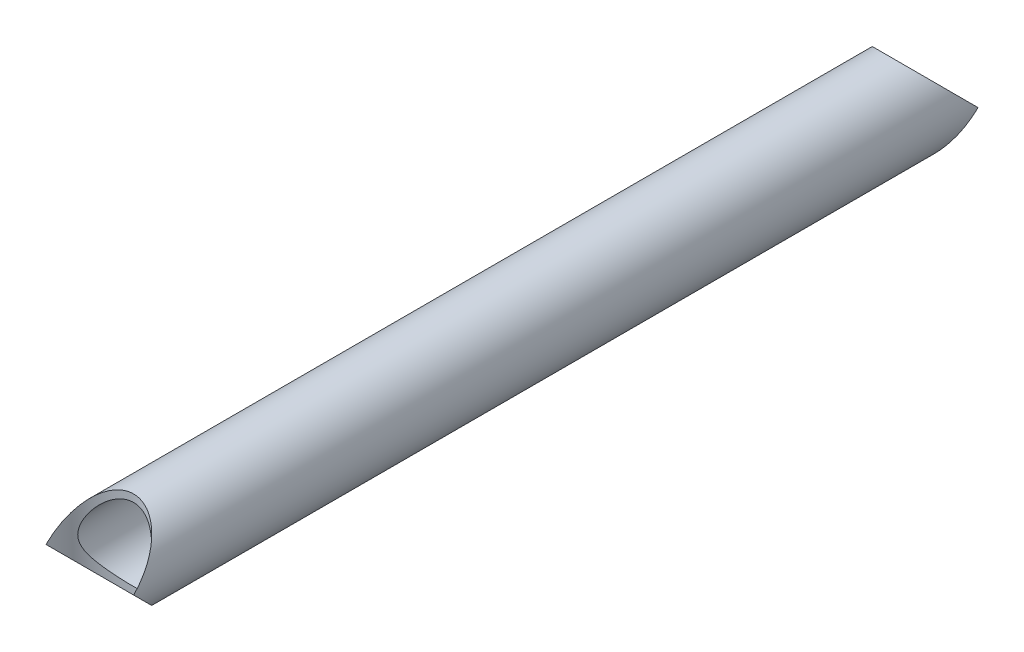
ISO-10303-21;
HEADER;
FILE_DESCRIPTION(('STEP AP214'),'2;1');
FILE_NAME('part.step','',(''),(''),'','','');
FILE_SCHEMA(('AUTOMOTIVE_DESIGN { 1 0 10303 214 1 1 1 1 }'));
ENDSEC;
DATA;
#1=APPLICATION_CONTEXT('core data for automotive mechanical design processes');
#2=APPLICATION_PROTOCOL_DEFINITION('international standard','automotive_design',2000,#1);
#3=PRODUCT_CONTEXT('',#1,'mechanical');
#4=PRODUCT('Part','Part','',(#3));
#5=PRODUCT_RELATED_PRODUCT_CATEGORY('part','',(#4));
#6=PRODUCT_DEFINITION_FORMATION('','',#4);
#7=PRODUCT_DEFINITION_CONTEXT('part definition',#1,'design');
#8=PRODUCT_DEFINITION('design','',#6,#7);
#9=PRODUCT_DEFINITION_SHAPE('','',#8);
#10=(LENGTH_UNIT() NAMED_UNIT(*) SI_UNIT(.MILLI.,.METRE.));
#11=(NAMED_UNIT(*) PLANE_ANGLE_UNIT() SI_UNIT($,.RADIAN.));
#12=(NAMED_UNIT(*) SI_UNIT($,.STERADIAN.) SOLID_ANGLE_UNIT());
#13=UNCERTAINTY_MEASURE_WITH_UNIT(LENGTH_MEASURE(1.E-05),#10,'distance_accuracy_value','');
#14=(GEOMETRIC_REPRESENTATION_CONTEXT(3) GLOBAL_UNCERTAINTY_ASSIGNED_CONTEXT((#13)) GLOBAL_UNIT_ASSIGNED_CONTEXT((#10,
#11,#12)) REPRESENTATION_CONTEXT('',''));
#15=CARTESIAN_POINT('',(0.,0.,0.));
#16=DIRECTION('',(0.,0.,1.));
#17=DIRECTION('',(1.,0.,0.));
#18=AXIS2_PLACEMENT_3D('',#15,#16,#17);
#19=CARTESIAN_POINT('',(0.,-609.6,0.));
#20=DIRECTION('',(0.,1.,0.));
#21=DIRECTION('',(1.,0.,0.));
#22=AXIS2_PLACEMENT_3D('',#19,#20,#21);
#23=CYLINDRICAL_SURFACE('',#22,21.082);
#24=CARTESIAN_POINT('',(0.,0.,0.));
#25=DIRECTION('',(0.,-0.707106781186548,0.707106781186548));
#26=DIRECTION('',(0.,0.707106781186548,0.707106781186548));
#27=AXIS2_PLACEMENT_3D('',#24,#25,#26);
#28=ELLIPSE('',#27,29.8144503219496,21.082);
#29=CARTESIAN_POINT('',(21.082,0.,0.));
#30=VERTEX_POINT('',#29);
#31=CARTESIAN_POINT('',(-21.082,0.,0.));
#32=VERTEX_POINT('',#31);
#33=EDGE_CURVE('E36',#30,#32,#28,.T.);
#34=ORIENTED_EDGE('',*,*,#33,.F.);
#35=CARTESIAN_POINT('',(0.,0.,0.));
#36=DIRECTION('',(0.,0.707106781186548,0.707106781186548));
#37=DIRECTION('',(0.,-0.707106781186548,0.707106781186548));
#38=AXIS2_PLACEMENT_3D('',#35,#36,#37);
#39=ELLIPSE('',#38,29.8144503219496,21.082);
#40=EDGE_CURVE('E49',#32,#30,#39,.T.);
#41=ORIENTED_EDGE('',*,*,#40,.F.);
#42=EDGE_LOOP('',(#34,#41));
#43=FACE_BOUND('',#42,.T.);
#44=CARTESIAN_POINT('',(-17.526,0.,11.7170835961855));
#45=CARTESIAN_POINT('',(-17.5260016378947,-0.311185239624754,11.7170794235319));
#46=CARTESIAN_POINT('',(-17.5176931015294,-0.622351445218559,11.7295369553151));
#47=CARTESIAN_POINT('',(-17.4846988539183,-1.24185385401228,11.7786627526484));
#48=CARTESIAN_POINT('',(-17.4600137345834,-1.55019015908704,11.8153301431635));
#49=CARTESIAN_POINT('',(-17.3948143787621,-2.16244529665251,11.9111077063955));
#50=CARTESIAN_POINT('',(-17.3542585500645,-2.4663503275123,11.970276837618));
#51=CARTESIAN_POINT('',(-17.2582022882152,-3.06720718463188,12.1083537448172));
#52=CARTESIAN_POINT('',(-17.2026991564801,-3.36415774479985,12.187265084866));
#53=CARTESIAN_POINT('',(-17.0535843130683,-4.06302745628092,12.3954854161195));
#54=CARTESIAN_POINT('',(-16.9535301925097,-4.46127907530088,12.5324954128564));
#55=CARTESIAN_POINT('',(-16.7288372054571,-5.24134070736922,12.8308841424232));
#56=CARTESIAN_POINT('',(-16.6041869119637,-5.62314297747684,12.992274193646));
#57=CARTESIAN_POINT('',(-16.3317636320621,-6.37126683424937,13.3331138948044));
#58=CARTESIAN_POINT('',(-16.1839327090337,-6.73754662963666,13.5126083819292));
#59=CARTESIAN_POINT('',(-15.8666576854035,-7.4540832758881,13.8837883044527));
#60=CARTESIAN_POINT('',(-15.6972143279038,-7.80434067708934,14.0754733205898));
#61=CARTESIAN_POINT('',(-15.2583916209031,-8.64017899381098,14.552604898062));
#62=CARTESIAN_POINT('',(-14.9778300302294,-9.11754391622342,14.8422186294483));
#63=CARTESIAN_POINT('',(-14.3747358658228,-10.0415160632169,15.427068966364));
#64=CARTESIAN_POINT('',(-14.0521855719281,-10.4881101794549,15.7223079006928));
#65=CARTESIAN_POINT('',(-13.3658527392673,-11.3497898907658,16.3097708832751));
#66=CARTESIAN_POINT('',(-13.0021052837983,-11.7649018003026,16.6019972690064));
#67=CARTESIAN_POINT('',(-12.233300311435,-12.5623875794975,17.1763567539256));
#68=CARTESIAN_POINT('',(-11.8282584025824,-12.944773718712,17.4584936125817));
#69=CARTESIAN_POINT('',(-11.0669192234582,-13.5970346278618,17.9480753218691));
#70=CARTESIAN_POINT('',(-10.7183987975034,-13.8736134382401,18.1587085988652));
#71=CARTESIAN_POINT('',(-9.99596445975381,-14.4028407038532,18.5661882812012));
#72=CARTESIAN_POINT('',(-9.62205154611136,-14.6554900987946,18.7630352278501));
#73=CARTESIAN_POINT('',(-8.85000453279148,-15.1342035654356,19.1392871353364));
#74=CARTESIAN_POINT('',(-8.45190333226408,-15.3603025729126,19.3187149616181));
#75=CARTESIAN_POINT('',(-7.63224400398983,-15.7836038697298,19.6569582270187));
#76=CARTESIAN_POINT('',(-7.21069012767881,-15.9808113730436,19.8157773847372));
#77=CARTESIAN_POINT('',(-6.42051007803403,-16.3122154450185,20.0840901579273));
#78=CARTESIAN_POINT('',(-6.05526187412119,-16.4514151662288,20.1973686661908));
#79=CARTESIAN_POINT('',(-5.31159989558677,-16.706346482185,20.4055542524311));
#80=CARTESIAN_POINT('',(-4.93318862342575,-16.822082509407,20.5004648001058));
#81=CARTESIAN_POINT('',(-4.16529168273311,-17.0284767212216,20.6701624989867));
#82=CARTESIAN_POINT('',(-3.77580987215481,-17.1191435267946,20.7449565677474));
#83=CARTESIAN_POINT('',(-2.98810662755952,-17.2740554751118,20.8729762207129));
#84=CARTESIAN_POINT('',(-2.58988509279097,-17.3383003130948,20.9262015561354));
#85=CARTESIAN_POINT('',(-1.78589985576378,-17.4394973865413,21.0101240435934));
#86=CARTESIAN_POINT('',(-1.38011148961267,-17.4763337840664,21.0407255758502));
#87=CARTESIAN_POINT('',(-0.565854491199032,-17.5216078754302,21.0783450739343));
#88=CARTESIAN_POINT('',(-0.15738585335124,-17.5300455100714,21.0853629906013));
#89=CARTESIAN_POINT('',(0.658840305394848,-17.5183673988472,21.0756550169734));
#90=CARTESIAN_POINT('',(1.06659785274316,-17.4982527387285,21.0589300295404));
#91=CARTESIAN_POINT('',(1.87807893983286,-17.4298388579758,21.0021181574441));
#92=CARTESIAN_POINT('',(2.28180261501628,-17.3815405868964,20.9620320598569));
#93=CARTESIAN_POINT('',(3.05546264031582,-17.2617419142674,20.8628075465109));
#94=CARTESIAN_POINT('',(3.42586003012291,-17.1919987114047,20.8051139320896));
#95=CARTESIAN_POINT('',(4.15817336909838,-17.0297069941817,20.6712086315105));
#96=CARTESIAN_POINT('',(4.52008977395022,-16.937159708176,20.5949979427882));
#97=CARTESIAN_POINT('',(5.23359484929569,-16.7304558932916,20.4253449651873));
#98=CARTESIAN_POINT('',(5.58518194067369,-16.6162960800062,20.3319000573192));
#99=CARTESIAN_POINT('',(6.27643426134676,-16.3677116370536,20.1292536222194));
#100=CARTESIAN_POINT('',(6.61609878682275,-16.2332858135049,20.0200511667184));
#101=CARTESIAN_POINT('',(7.31109089686547,-15.9331108592373,19.7774011684013));
#102=CARTESIAN_POINT('',(7.66523513049859,-15.765658679436,19.6426739100496));
#103=CARTESIAN_POINT('',(8.35689209437835,-15.4101996598829,19.3585354967505));
#104=CARTESIAN_POINT('',(8.69440404672022,-15.2221918600498,19.2091236559707));
#105=CARTESIAN_POINT('',(9.35209844960762,-14.8272083285566,18.8976558413728));
#106=CARTESIAN_POINT('',(9.67227794419842,-14.6202293775806,18.7355977222363));
#107=CARTESIAN_POINT('',(10.2948186721717,-14.1887580520627,18.4008796109905));
#108=CARTESIAN_POINT('',(10.5971773894446,-13.9642632148072,18.2282181287897));
#109=CARTESIAN_POINT('',(11.244684971049,-13.4507289160127,17.8375687941069));
#110=CARTESIAN_POINT('',(11.5856940585288,-13.1579624545575,17.6176099712067));
#111=CARTESIAN_POINT('',(12.2411720036753,-12.5504633562745,17.1686423372183));
#112=CARTESIAN_POINT('',(12.5556369249827,-12.2357274740969,16.9396321912342));
#113=CARTESIAN_POINT('',(13.1584286905593,-11.5850519846574,16.4757793097621));
#114=CARTESIAN_POINT('',(13.446714754031,-11.2490806325737,16.2409281763895));
#115=CARTESIAN_POINT('',(13.9965511777057,-10.5571079156422,15.7695396585636));
#116=CARTESIAN_POINT('',(14.2581033442004,-10.2011079065658,15.5330023891917));
#117=CARTESIAN_POINT('',(14.7570366580727,-9.46521810557,15.0598817475067));
#118=CARTESIAN_POINT('',(14.9941216137858,-9.08510932065605,14.8233262589546));
#119=CARTESIAN_POINT('',(15.4403622641035,-8.30410846278527,14.3579192105154));
#120=CARTESIAN_POINT('',(15.6495111177599,-7.90321133245439,14.1290695478423));
#121=CARTESIAN_POINT('',(16.0384509266286,-7.0806388364223,13.6859616011569));
#122=CARTESIAN_POINT('',(16.2182912005026,-6.65899996365618,13.4716791661005));
#123=CARTESIAN_POINT('',(16.5471956443401,-5.7935329548292,13.0655732903307));
#124=CARTESIAN_POINT('',(16.696280162227,-5.34971973228998,12.8737350372167));
#125=CARTESIAN_POINT('',(16.9096872269796,-4.6159917421715,12.5909260766296));
#126=CARTESIAN_POINT('',(16.9844727479109,-4.33305990670588,12.4896691875633));
#127=CARTESIAN_POINT('',(17.1206528131974,-3.75910386380244,12.3023316690525));
#128=CARTESIAN_POINT('',(17.1820521342226,-3.46808258489748,12.2162456282212));
#129=CARTESIAN_POINT('',(17.2904590721008,-2.87925352198581,12.0623224316295));
#130=CARTESIAN_POINT('',(17.3374971591084,-2.58146156719816,11.9944466768579));
#131=CARTESIAN_POINT('',(17.4164527674171,-1.97986154206129,11.8795111123051));
#132=CARTESIAN_POINT('',(17.4483707185722,-1.67605364299665,11.8324507107618));
#133=CARTESIAN_POINT('',(17.4965707933311,-1.06142244679824,11.7610644895283));
#134=CARTESIAN_POINT('',(17.5126944221406,-0.750559438662855,11.7369691864769));
#135=CARTESIAN_POINT('',(17.5283064038534,-0.127486752535119,11.7136418313979));
#136=CARTESIAN_POINT('',(17.5277956602287,0.184722851397884,11.7144084290319));
#137=CARTESIAN_POINT('',(17.5101485211154,0.807835261309463,11.7407693262134));
#138=CARTESIAN_POINT('',(17.4929998394571,1.11873693105035,11.7663819731513));
#139=CARTESIAN_POINT('',(17.4425276727906,1.73636752581663,11.8410705264514));
#140=CARTESIAN_POINT('',(17.4092017106118,2.04309580438799,11.8901500261935));
#141=CARTESIAN_POINT('',(17.3202684324222,2.70129580173779,12.0194075579903));
#142=CARTESIAN_POINT('',(17.2618591297115,3.05163094171089,12.1034240158727));
#143=CARTESIAN_POINT('',(17.125544653635,3.74168673817612,12.2955381960971));
#144=CARTESIAN_POINT('',(17.0476346833835,4.08140475984631,12.403641842824));
#145=CARTESIAN_POINT('',(16.8735380534471,4.75017183758825,12.6394597248944));
#146=CARTESIAN_POINT('',(16.7773015999041,5.07918889906018,12.7672272019709));
#147=CARTESIAN_POINT('',(16.5679251651736,5.72537291471267,13.0377868068708));
#148=CARTESIAN_POINT('',(16.4547840559982,6.04253907635777,13.1805799371149));
#149=CARTESIAN_POINT('',(16.1420461654977,6.84649854955788,13.5637984152024));
#150=CARTESIAN_POINT('',(15.9304484628453,7.32461540499263,13.8126893643339));
#151=CARTESIAN_POINT('',(15.469742749578,8.25327584896658,14.3268004694395));
#152=CARTESIAN_POINT('',(15.2206141148923,8.70380408430256,14.5920295559139));
#153=CARTESIAN_POINT('',(14.685783858587,9.57870297739549,15.1301886751321));
#154=CARTESIAN_POINT('',(14.4000361208074,10.0030396349768,15.4031280740317));
#155=CARTESIAN_POINT('',(13.7927902751821,10.8250002111713,15.9491834168155));
#156=CARTESIAN_POINT('',(13.4712992021977,11.2226293616244,16.2222993154787));
#157=CARTESIAN_POINT('',(12.7799006234576,12.0048882555959,16.7728164869347));
#158=CARTESIAN_POINT('',(12.4086316211086,12.3884749126374,17.0499957368036));
#159=CARTESIAN_POINT('',(11.6276478455591,13.1242664808955,17.5918888173235));
#160=CARTESIAN_POINT('',(11.2179265250184,13.4764660277999,17.8566005135371));
#161=CARTESIAN_POINT('',(10.3612672323301,14.145646554196,18.3668904148318));
#162=CARTESIAN_POINT('',(9.91442105137389,14.4627101247529,18.6125130662574));
#163=CARTESIAN_POINT('',(9.21669876910991,14.9093724844697,18.9623554646115));
#164=CARTESIAN_POINT('',(8.97958368951618,15.0534199394608,19.0758566609264));
#165=CARTESIAN_POINT('',(8.49628270026581,15.3313920219185,19.2959688093741));
#166=CARTESIAN_POINT('',(8.25009466435528,15.4653142538034,19.4025781300609));
#167=CARTESIAN_POINT('',(7.64828647045942,15.7740353493854,19.64938964824));
#168=CARTESIAN_POINT('',(7.28844211338097,15.9436374285179,19.7858779719994));
#169=CARTESIAN_POINT('',(6.55290444190079,16.2597758929261,20.0414998170308));
#170=CARTESIAN_POINT('',(6.17721525857188,16.4063182437829,20.1606378262551));
#171=CARTESIAN_POINT('',(5.41170805813672,16.6744852599453,20.3794627217077));
#172=CARTESIAN_POINT('',(5.02189676543482,16.7961216056681,20.4791587247984));
#173=CARTESIAN_POINT('',(4.23014401773319,17.012789133161,20.6572319450956));
#174=CARTESIAN_POINT('',(3.82820225407401,17.1078196373128,20.7356086193235));
#175=CARTESIAN_POINT('',(3.01240280049657,17.2702087031939,20.8697879593399));
#176=CARTESIAN_POINT('',(2.59848725210842,17.3373944048851,20.9254495787255));
#177=CARTESIAN_POINT('',(1.7643465795866,17.4420303309739,21.0122253324729));
#178=CARTESIAN_POINT('',(1.34412146523769,17.4794806014797,21.0433395048985));
#179=CARTESIAN_POINT('',(0.501049558004271,17.5239199181906,21.0802671778015));
#180=CARTESIAN_POINT('',(0.0782034121153955,17.5309162037693,21.0860866912022));
#181=CARTESIAN_POINT('',(-0.766452841317305,17.5143262226544,21.0722957342077));
#182=CARTESIAN_POINT('',(-1.18826301601354,17.4907419935961,21.0526869581457));
#183=CARTESIAN_POINT('',(-1.98788490913908,17.4170841881761,20.9915339827169));
#184=CARTESIAN_POINT('',(-2.36612013468804,17.3696960042558,20.9522142078891));
#185=CARTESIAN_POINT('',(-3.11616450870983,17.2509229834362,20.8538553405763));
#186=CARTESIAN_POINT('',(-3.48797413891217,17.1795399537179,20.7948177331495));
#187=CARTESIAN_POINT('',(-4.22296419237803,17.0137946902071,20.6580992459665));
#188=CARTESIAN_POINT('',(-4.58614351078462,16.9194295314405,20.580415993166));
#189=CARTESIAN_POINT('',(-5.30192354415742,16.7089637385302,20.4077411491116));
#190=CARTESIAN_POINT('',(-5.65452365219896,16.5928618601163,20.3127485670318));
#191=CARTESIAN_POINT('',(-6.36399761707212,16.3343025519063,20.1020796021486));
#192=CARTESIAN_POINT('',(-6.72028282825472,16.1908572417631,19.985636628175));
#193=CARTESIAN_POINT('',(-7.41814865422394,15.8832360301542,19.7372491080794));
#194=CARTESIAN_POINT('',(-7.75972923075392,15.7190600747585,19.6053045216306));
#195=CARTESIAN_POINT('',(-8.42721585313395,15.3715416074325,19.3277881488529));
#196=CARTESIAN_POINT('',(-8.7531218054942,15.1881989812052,19.1822162812607));
#197=CARTESIAN_POINT('',(-9.38863490224722,14.8037894086195,18.8793070668651));
#198=CARTESIAN_POINT('',(-9.69823878032588,14.6027189316968,18.7219673774091));
#199=CARTESIAN_POINT('',(-10.4414710002701,14.0863757170536,18.3215268901985));
#200=CARTESIAN_POINT('',(-10.8654797714758,13.7616297139406,18.0726963048078));
#201=CARTESIAN_POINT('',(-11.6768821386589,13.0802149259052,17.5593793522509));
#202=CARTESIAN_POINT('',(-12.064261019764,12.723533423006,17.294886762183));
#203=CARTESIAN_POINT('',(-12.8036491868346,11.9792953739006,16.7549288155896));
#204=CARTESIAN_POINT('',(-13.1555093209752,11.5916199606557,16.479423460715));
#205=CARTESIAN_POINT('',(-13.8219877892585,10.7882226138892,15.9245507663208));
#206=CARTESIAN_POINT('',(-14.1366120496169,10.3725051599326,15.6451840492753));
#207=CARTESIAN_POINT('',(-14.7337377450349,9.50576680677234,15.0843758157883));
#208=CARTESIAN_POINT('',(-15.0155658912318,9.05424836320318,14.8029862129606));
#209=CARTESIAN_POINT('',(-15.5398276170169,8.12162517178268,14.2516317215844));
#210=CARTESIAN_POINT('',(-15.7822404962628,7.64050505920322,13.9816728910043));
#211=CARTESIAN_POINT('',(-16.1140950182191,6.89707752392888,13.594686833023));
#212=CARTESIAN_POINT('',(-16.2192180576643,6.64623211980647,13.4689462707244));
#213=CARTESIAN_POINT('',(-16.4187602672639,6.13676732769558,13.2249718918047));
#214=CARTESIAN_POINT('',(-16.5131786075082,5.87814733892566,13.1067386575212));
#215=CARTESIAN_POINT('',(-16.7794342334218,5.09093726520827,12.7665131425477));
#216=CARTESIAN_POINT('',(-16.9346599661884,4.5501369317475,12.5585331694057));
#217=CARTESIAN_POINT('',(-17.1391936180726,3.67633247278782,12.2766050155908));
#218=CARTESIAN_POINT('',(-17.205406088342,3.35339503807189,12.1833790593107));
#219=CARTESIAN_POINT('',(-17.3201691751224,2.69865889204739,12.0196692766856));
#220=CARTESIAN_POINT('',(-17.3687234597521,2.36686203648772,11.9491807274641));
#221=CARTESIAN_POINT('',(-17.4468189322611,1.69770604668946,11.834866522402));
#222=CARTESIAN_POINT('',(-17.476429342286,1.3603718369951,11.7909438257341));
#223=CARTESIAN_POINT('',(-17.5160177178801,0.682017146869626,11.7320565086233));
#224=CARTESIAN_POINT('',(-17.5259982051931,0.3409971455913,11.7170881685842));
#225=CARTESIAN_POINT('',(-17.526,0.,11.7170835961855));
#226=B_SPLINE_CURVE_WITH_KNOTS('',3,(#44,#45,#46,#47,#48,#49,#50,#51,#52,#53,#54,#55,#56,#57,
#58,#59,#60,#61,#62,#63,#64,#65,#66,#67,#68,#69,#70,#71,#72,#73,#74,#75,#76,#77,#78,#79,#80,#81,
#82,#83,#84,#85,#86,#87,#88,#89,#90,#91,#92,#93,#94,#95,#96,#97,#98,#99,#100,#101,#102,#103,
#104,#105,#106,#107,#108,#109,#110,#111,#112,#113,#114,#115,#116,#117,#118,#119,#120,#121,#122,
#123,#124,#125,#126,#127,#128,#129,#130,#131,#132,#133,#134,#135,#136,#137,#138,#139,#140,#141,
#142,#143,#144,#145,#146,#147,#148,#149,#150,#151,#152,#153,#154,#155,#156,#157,#158,#159,#160,
#161,#162,#163,#164,#165,#166,#167,#168,#169,#170,#171,#172,#173,#174,#175,#176,#177,#178,#179,
#180,#181,#182,#183,#184,#185,#186,#187,#188,#189,#190,#191,#192,#193,#194,#195,#196,#197,#198,
#199,#200,#201,#202,#203,#204,#205,#206,#207,#208,#209,#210,#211,#212,#213,#214,#215,#216,#217,
#218,#219,#220,#221,#222,#223,#224,#225),.UNSPECIFIED.,.T.,.F.,(4,2,2,2,2,2,2,2,2,2,2,2,2,2,2,2,
2,2,2,2,2,2,2,2,2,2,2,2,2,2,2,2,2,2,2,2,2,2,2,2,2,2,2,2,2,2,2,2,2,2,2,2,2,2,2,2,2,2,2,2,2,2,2,2,
2,2,2,2,2,2,2,2,2,2,2,2,2,2,2,2,2,2,2,2,2,2,2,2,2,2,4),(0.,0.933172693022054,1.8663116595326,
2.80191264993148,3.73768266693524,5.03421487261753,6.33135085124984,7.63178208439843,
8.93216861675469,10.8043377121159,12.6772994813249,14.5486780714614,16.4193519416874,
17.8948685619845,19.3703272147972,20.8438221291614,22.3170507973489,23.5367196852797,
24.7561579530497,25.9751763487712,27.1942088047281,28.4183645138433,29.6425227747185,
30.8666344862648,32.0907049577552,33.2333470618126,34.3759276302668,35.5186819736788,
36.6615036636894,37.9030932180036,39.1447407874231,40.3865994501214,41.6286330324567,
43.1283930869263,44.6283751585665,46.1306551588403,47.6328335894824,49.1514688241532,
50.670475260672,52.1868986081185,53.7023154536196,54.6306896856113,55.5587320966309,
56.484791577948,57.4108247305145,58.3460581596758,59.2812407930624,60.2171145315851,
61.1531316224146,62.2463414280461,63.3398204124099,64.4363139481779,65.5328806817875,
67.2674715330129,69.0030190806109,70.7407741677449,72.4781878402609,74.2806100835346,
76.0833397869957,77.881737821774,78.7806894706804,79.6798531461848,80.9403031602997,
82.2004265563946,83.4599576194234,84.7195207582445,85.9867901712291,87.254057619157,
88.5210238019549,89.7879055688289,90.9362330678383,92.0844740994954,93.2328613461459,
94.3813143497834,95.5841651482628,96.7870190759765,97.9898801771085,99.1929813757515,
100.958060446859,102.723845595493,104.496761581516,106.269395021408,108.073655659627,
109.878860830614,110.77743100118,111.676070788202,113.470212940669,114.496902002416,
115.523377668994,116.546080774989,117.568652491591),.UNSPECIFIED.);
#227=CARTESIAN_POINT('',(-17.526,0.,11.7170835961855));
#228=VERTEX_POINT('',#227);
#229=EDGE_CURVE('E10',#228,#228,#226,.F.);
#230=ORIENTED_EDGE('',*,*,#229,.F.);
#231=EDGE_LOOP('',(#230));
#232=FACE_BOUND('',#231,.T.);
#233=ADVANCED_FACE('F16',(#43,#232),#23,.F.);
#234=CARTESIAN_POINT('',(0.,-609.6,406.4));
#235=DIRECTION('',(0.,-1.,0.));
#236=DIRECTION('',(0.,0.,-1.));
#237=AXIS2_PLACEMENT_3D('',#234,#235,#236);
#238=CYLINDRICAL_SURFACE('',#237,21.082);
#239=CARTESIAN_POINT('',(0.,0.,406.4));
#240=DIRECTION('',(0.,-0.707106781186547,-0.707106781186548));
#241=DIRECTION('',(0.,0.707106781186548,-0.707106781186547));
#242=AXIS2_PLACEMENT_3D('',#239,#240,#241);
#243=ELLIPSE('',#242,29.8144503219496,21.082);
#244=CARTESIAN_POINT('',(-21.082,0.,406.4));
#245=VERTEX_POINT('',#244);
#246=CARTESIAN_POINT('',(21.082,0.,406.4));
#247=VERTEX_POINT('',#246);
#248=EDGE_CURVE('E44',#245,#247,#243,.T.);
#249=ORIENTED_EDGE('',*,*,#248,.F.);
#250=CARTESIAN_POINT('',(0.,0.,406.4));
#251=DIRECTION('',(0.,0.707106781186547,-0.707106781186548));
#252=DIRECTION('',(0.,-0.707106781186548,-0.707106781186547));
#253=AXIS2_PLACEMENT_3D('',#250,#251,#252);
#254=ELLIPSE('',#253,29.8144503219496,21.082);
#255=EDGE_CURVE('E48',#247,#245,#254,.T.);
#256=ORIENTED_EDGE('',*,*,#255,.F.);
#257=EDGE_LOOP('',(#249,#256));
#258=FACE_BOUND('',#257,.T.);
#259=CARTESIAN_POINT('',(17.526,0.,394.682916403815));
#260=CARTESIAN_POINT('',(17.5260016378947,-0.311185239624767,394.682920576468));
#261=CARTESIAN_POINT('',(17.5176931015294,-0.62235144521857,394.670463044685));
#262=CARTESIAN_POINT('',(17.4846988539183,-1.24185385401229,394.621337247352));
#263=CARTESIAN_POINT('',(17.4600137345834,-1.55019015908705,394.584669856837));
#264=CARTESIAN_POINT('',(17.3948143787621,-2.16244529665252,394.488892293605));
#265=CARTESIAN_POINT('',(17.3542585500645,-2.46635032751232,394.429723162382));
#266=CARTESIAN_POINT('',(17.2582022882152,-3.06720718463191,394.291646255183));
#267=CARTESIAN_POINT('',(17.2026991564801,-3.36415774479987,394.212734915134));
#268=CARTESIAN_POINT('',(17.0535843130683,-4.06302745628092,394.004514583881));
#269=CARTESIAN_POINT('',(16.9535301925097,-4.46127907530089,393.867504587144));
#270=CARTESIAN_POINT('',(16.7288372054571,-5.24134070736923,393.569115857577));
#271=CARTESIAN_POINT('',(16.6041869119637,-5.62314297747685,393.407725806354));
#272=CARTESIAN_POINT('',(16.3317636320621,-6.37126683424939,393.066886105196));
#273=CARTESIAN_POINT('',(16.1839327090337,-6.73754662963668,392.887391618071));
#274=CARTESIAN_POINT('',(15.8666576854035,-7.45408327588812,392.516211695547));
#275=CARTESIAN_POINT('',(15.6972143279038,-7.80434067708935,392.32452667941));
#276=CARTESIAN_POINT('',(15.2583916209031,-8.64017899381098,391.847395101938));
#277=CARTESIAN_POINT('',(14.9778300302294,-9.11754391622342,391.557781370552));
#278=CARTESIAN_POINT('',(14.3747358658228,-10.0415160632169,390.972931033636));
#279=CARTESIAN_POINT('',(14.0521855719281,-10.4881101794549,390.677692099307));
#280=CARTESIAN_POINT('',(13.3658527392673,-11.3497898907658,390.090229116725));
#281=CARTESIAN_POINT('',(13.0021052837983,-11.7649018003026,389.798002730994));
#282=CARTESIAN_POINT('',(12.233300311435,-12.5623875794975,389.223643246074));
#283=CARTESIAN_POINT('',(11.8282584025823,-12.944773718712,388.941506387418));
#284=CARTESIAN_POINT('',(11.0669192234582,-13.5970346278618,388.451924678131));
#285=CARTESIAN_POINT('',(10.7183987975033,-13.8736134382401,388.241291401135));
#286=CARTESIAN_POINT('',(9.99596445975378,-14.4028407038533,387.833811718799));
#287=CARTESIAN_POINT('',(9.62205154611133,-14.6554900987947,387.63696477215));
#288=CARTESIAN_POINT('',(8.85000453279145,-15.1342035654356,387.260712864664));
#289=CARTESIAN_POINT('',(8.45190333226405,-15.3603025729126,387.081285038382));
#290=CARTESIAN_POINT('',(7.63224400398979,-15.7836038697299,386.743041772981));
#291=CARTESIAN_POINT('',(7.21069012767877,-15.9808113730436,386.584222615263));
#292=CARTESIAN_POINT('',(6.42051007803398,-16.3122154450185,386.315909842073));
#293=CARTESIAN_POINT('',(6.05526187412114,-16.4514151662288,386.202631333809));
#294=CARTESIAN_POINT('',(5.31159989558671,-16.7063464821851,385.994445747569));
#295=CARTESIAN_POINT('',(4.93318862342569,-16.8220825094071,385.899535199894));
#296=CARTESIAN_POINT('',(4.16529168273305,-17.0284767212217,385.729837501013));
#297=CARTESIAN_POINT('',(3.77580987215475,-17.1191435267946,385.655043432253));
#298=CARTESIAN_POINT('',(2.98810662755946,-17.2740554751118,385.527023779287));
#299=CARTESIAN_POINT('',(2.58988509279091,-17.3383003130948,385.473798443865));
#300=CARTESIAN_POINT('',(1.78589985576373,-17.4394973865413,385.389875956407));
#301=CARTESIAN_POINT('',(1.38011148961261,-17.4763337840664,385.35927442415));
#302=CARTESIAN_POINT('',(0.565854491198974,-17.5216078754302,385.321654926066));
#303=CARTESIAN_POINT('',(0.157385853351181,-17.5300455100714,385.314637009399));
#304=CARTESIAN_POINT('',(-0.658840305394907,-17.5183673988472,385.324344983027));
#305=CARTESIAN_POINT('',(-1.06659785274322,-17.4982527387285,385.34106997046));
#306=CARTESIAN_POINT('',(-1.87807893983292,-17.4298388579758,385.397881842556));
#307=CARTESIAN_POINT('',(-2.28180261501634,-17.3815405868964,385.437967940143));
#308=CARTESIAN_POINT('',(-3.05546264031588,-17.2617419142674,385.537192453489));
#309=CARTESIAN_POINT('',(-3.42586003012297,-17.1919987114047,385.59488606791));
#310=CARTESIAN_POINT('',(-4.15817336909844,-17.0297069941817,385.72879136849));
#311=CARTESIAN_POINT('',(-4.52008977395028,-16.937159708176,385.805002057212));
#312=CARTESIAN_POINT('',(-5.23359484929575,-16.7304558932916,385.974655034813));
#313=CARTESIAN_POINT('',(-5.58518194067376,-16.6162960800062,386.068099942681));
#314=CARTESIAN_POINT('',(-6.27643426134682,-16.3677116370536,386.270746377781));
#315=CARTESIAN_POINT('',(-6.61609878682281,-16.2332858135048,386.379948833282));
#316=CARTESIAN_POINT('',(-7.31109089686552,-15.9331108592373,386.622598831599));
#317=CARTESIAN_POINT('',(-7.66523513049864,-15.765658679436,386.75732608995));
#318=CARTESIAN_POINT('',(-8.35689209437839,-15.4101996598828,387.041464503249));
#319=CARTESIAN_POINT('',(-8.69440404672025,-15.2221918600498,387.190876344029));
#320=CARTESIAN_POINT('',(-9.35209844960766,-14.8272083285566,387.502344158627));
#321=CARTESIAN_POINT('',(-9.67227794419846,-14.6202293775806,387.664402277764));
#322=CARTESIAN_POINT('',(-10.2948186721717,-14.1887580520627,387.99912038901));
#323=CARTESIAN_POINT('',(-10.5971773894447,-13.9642632148072,388.17178187121));
#324=CARTESIAN_POINT('',(-11.244684971049,-13.4507289160126,388.562431205893));
#325=CARTESIAN_POINT('',(-11.5856940585288,-13.1579624545574,388.782390028793));
#326=CARTESIAN_POINT('',(-12.2411720036753,-12.5504633562744,389.231357662782));
#327=CARTESIAN_POINT('',(-12.5556369249827,-12.2357274740969,389.460367808766));
#328=CARTESIAN_POINT('',(-13.1584286905594,-11.5850519846574,389.924220690238));
#329=CARTESIAN_POINT('',(-13.446714754031,-11.2490806325736,390.159071823611));
#330=CARTESIAN_POINT('',(-13.9965511777057,-10.5571079156421,390.630460341437));
#331=CARTESIAN_POINT('',(-14.2581033442004,-10.2011079065657,390.866997610808));
#332=CARTESIAN_POINT('',(-14.7570366580728,-9.46521810556994,391.340118252493));
#333=CARTESIAN_POINT('',(-14.9941216137859,-9.08510932065601,391.576673741046));
#334=CARTESIAN_POINT('',(-15.4403622641035,-8.30410846278523,392.042080789485));
#335=CARTESIAN_POINT('',(-15.6495111177599,-7.90321133245435,392.270930452158));
#336=CARTESIAN_POINT('',(-16.0384509266286,-7.08063883642226,392.714038398843));
#337=CARTESIAN_POINT('',(-16.2182912005026,-6.65899996365614,392.9283208339));
#338=CARTESIAN_POINT('',(-16.5471956443401,-5.79353295482918,393.334426709669));
#339=CARTESIAN_POINT('',(-16.696280162227,-5.34971973228996,393.526264962783));
#340=CARTESIAN_POINT('',(-16.9096872269796,-4.61599174217148,393.80907392337));
#341=CARTESIAN_POINT('',(-16.9844727479109,-4.33305990670586,393.910330812437));
#342=CARTESIAN_POINT('',(-17.1206528131974,-3.75910386380242,394.097668330947));
#343=CARTESIAN_POINT('',(-17.1820521342226,-3.46808258489747,394.183754371779));
#344=CARTESIAN_POINT('',(-17.2904590721008,-2.8792535219858,394.337677568371));
#345=CARTESIAN_POINT('',(-17.3374971591084,-2.58146156719816,394.405553323142));
#346=CARTESIAN_POINT('',(-17.4164527674171,-1.97986154206128,394.520488887695));
#347=CARTESIAN_POINT('',(-17.4483707185722,-1.67605364299663,394.567549289238));
#348=CARTESIAN_POINT('',(-17.4965707933311,-1.06142244679821,394.638935510472));
#349=CARTESIAN_POINT('',(-17.5126944221406,-0.750559438662827,394.663030813523));
#350=CARTESIAN_POINT('',(-17.5283064038534,-0.127486752535088,394.686358168602));
#351=CARTESIAN_POINT('',(-17.5277956602287,0.184722851397918,394.685591570968));
#352=CARTESIAN_POINT('',(-17.5101485211154,0.807835261309503,394.659230673787));
#353=CARTESIAN_POINT('',(-17.4929998394571,1.1187369310504,394.633618026849));
#354=CARTESIAN_POINT('',(-17.4425276727906,1.73636752581667,394.558929473549));
#355=CARTESIAN_POINT('',(-17.4092017106118,2.04309580438802,394.509849973807));
#356=CARTESIAN_POINT('',(-17.3202684324222,2.70129580173783,394.38059244201));
#357=CARTESIAN_POINT('',(-17.2618591297115,3.05163094171093,394.296575984127));
#358=CARTESIAN_POINT('',(-17.125544653635,3.74168673817616,394.104461803903));
#359=CARTESIAN_POINT('',(-17.0476346833835,4.08140475984636,393.996358157176));
#360=CARTESIAN_POINT('',(-16.8735380534471,4.75017183758829,393.760540275106));
#361=CARTESIAN_POINT('',(-16.7773015999041,5.07918889906023,393.632772798029));
#362=CARTESIAN_POINT('',(-16.5679251651736,5.72537291471271,393.362213193129));
#363=CARTESIAN_POINT('',(-16.4547840559982,6.04253907635782,393.219420062885));
#364=CARTESIAN_POINT('',(-16.1420461654977,6.84649854955793,392.836201584798));
#365=CARTESIAN_POINT('',(-15.9304484628452,7.32461540499268,392.587310635666));
#366=CARTESIAN_POINT('',(-15.469742749578,8.25327584896663,392.073199530561));
#367=CARTESIAN_POINT('',(-15.2206141148923,8.70380408430261,391.807970444086));
#368=CARTESIAN_POINT('',(-14.6857838585869,9.57870297739554,391.269811324868));
#369=CARTESIAN_POINT('',(-14.4000361208074,10.0030396349768,390.996871925968));
#370=CARTESIAN_POINT('',(-13.7927902751821,10.8250002111714,390.450816583185));
#371=CARTESIAN_POINT('',(-13.4712992021977,11.2226293616245,390.177700684521));
#372=CARTESIAN_POINT('',(-12.7799006234576,12.0048882555959,389.627183513065));
#373=CARTESIAN_POINT('',(-12.4086316211085,12.3884749126374,389.350004263196));
#374=CARTESIAN_POINT('',(-11.6276478455591,13.1242664808955,388.808111182677));
#375=CARTESIAN_POINT('',(-11.2179265250184,13.4764660277999,388.543399486463));
#376=CARTESIAN_POINT('',(-10.3612672323301,14.145646554196,388.033109585168));
#377=CARTESIAN_POINT('',(-9.91442105137383,14.462710124753,387.787486933743));
#378=CARTESIAN_POINT('',(-9.21669876910986,14.9093724844698,387.437644535389));
#379=CARTESIAN_POINT('',(-8.97958368951612,15.0534199394608,387.324143339074));
#380=CARTESIAN_POINT('',(-8.49628270026574,15.3313920219186,387.104031190626));
#381=CARTESIAN_POINT('',(-8.25009466435521,15.4653142538034,386.997421869939));
#382=CARTESIAN_POINT('',(-7.64828647045935,15.7740353493854,386.75061035176));
#383=CARTESIAN_POINT('',(-7.28844211338089,15.943637428518,386.614122028001));
#384=CARTESIAN_POINT('',(-6.55290444190071,16.2597758929261,386.358500182969));
#385=CARTESIAN_POINT('',(-6.17721525857181,16.4063182437829,386.239362173745));
#386=CARTESIAN_POINT('',(-5.41170805813666,16.6744852599453,386.020537278292));
#387=CARTESIAN_POINT('',(-5.02189676543476,16.7961216056681,385.920841275202));
#388=CARTESIAN_POINT('',(-4.23014401773313,17.012789133161,385.742768054905));
#389=CARTESIAN_POINT('',(-3.82820225407397,17.1078196373129,385.664391380676));
#390=CARTESIAN_POINT('',(-3.01240280049653,17.2702087031939,385.53021204066));
#391=CARTESIAN_POINT('',(-2.59848725210838,17.3373944048851,385.474550421275));
#392=CARTESIAN_POINT('',(-1.76434657958655,17.4420303309739,385.387774667527));
#393=CARTESIAN_POINT('',(-1.34412146523765,17.4794806014797,385.356660495102));
#394=CARTESIAN_POINT('',(-0.501049558004232,17.5239199181906,385.319732822198));
#395=CARTESIAN_POINT('',(-0.0782034121153608,17.5309162037693,385.313913308798));
#396=CARTESIAN_POINT('',(0.766452841317334,17.5143262226544,385.327704265792));
#397=CARTESIAN_POINT('',(1.18826301601357,17.4907419935961,385.347313041854));
#398=CARTESIAN_POINT('',(1.98788490913912,17.4170841881761,385.408466017283));
#399=CARTESIAN_POINT('',(2.36612013468808,17.3696960042558,385.447785792111));
#400=CARTESIAN_POINT('',(3.11616450870987,17.2509229834362,385.546144659424));
#401=CARTESIAN_POINT('',(3.4879741389122,17.1795399537179,385.605182266851));
#402=CARTESIAN_POINT('',(4.22296419237806,17.0137946902071,385.741900754034));
#403=CARTESIAN_POINT('',(4.58614351078465,16.9194295314405,385.819584006834));
#404=CARTESIAN_POINT('',(5.30192354415745,16.7089637385302,385.992258850888));
#405=CARTESIAN_POINT('',(5.65452365219898,16.5928618601163,386.087251432968));
#406=CARTESIAN_POINT('',(6.36399761707214,16.3343025519063,386.297920397851));
#407=CARTESIAN_POINT('',(6.72028282825474,16.1908572417631,386.414363371825));
#408=CARTESIAN_POINT('',(7.41814865422396,15.8832360301541,386.662750891921));
#409=CARTESIAN_POINT('',(7.75972923075394,15.7190600747585,386.794695478369));
#410=CARTESIAN_POINT('',(8.42721585313397,15.3715416074325,387.072211851147));
#411=CARTESIAN_POINT('',(8.75312180549422,15.1881989812051,387.217783718739));
#412=CARTESIAN_POINT('',(9.38863490224724,14.8037894086194,387.520692933135));
#413=CARTESIAN_POINT('',(9.69823878032591,14.6027189316968,387.678032622591));
#414=CARTESIAN_POINT('',(10.4414710002701,14.0863757170536,388.078473109802));
#415=CARTESIAN_POINT('',(10.8654797714758,13.7616297139406,388.327303695192));
#416=CARTESIAN_POINT('',(11.676882138659,13.0802149259052,388.840620647749));
#417=CARTESIAN_POINT('',(12.064261019764,12.723533423006,389.105113237817));
#418=CARTESIAN_POINT('',(12.8036491868346,11.9792953739005,389.64507118441));
#419=CARTESIAN_POINT('',(13.1555093209753,11.5916199606556,389.920576539285));
#420=CARTESIAN_POINT('',(13.8219877892586,10.7882226138891,390.475449233679));
#421=CARTESIAN_POINT('',(14.136612049617,10.3725051599325,390.754815950725));
#422=CARTESIAN_POINT('',(14.7337377450349,9.5057668067723,391.315624184212));
#423=CARTESIAN_POINT('',(15.0155658912319,9.05424836320313,391.597013787039));
#424=CARTESIAN_POINT('',(15.539827617017,8.12162517178263,392.148368278416));
#425=CARTESIAN_POINT('',(15.7822404962628,7.64050505920316,392.418327108996));
#426=CARTESIAN_POINT('',(16.1140950182191,6.89707752392883,392.805313166977));
#427=CARTESIAN_POINT('',(16.2192180576643,6.64623211980643,392.931053729276));
#428=CARTESIAN_POINT('',(16.4187602672639,6.13676732769553,393.175028108195));
#429=CARTESIAN_POINT('',(16.5131786075083,5.87814733892562,393.293261342479));
#430=CARTESIAN_POINT('',(16.7794342334218,5.09093726520823,393.633486857452));
#431=CARTESIAN_POINT('',(16.9346599661884,4.55013693174744,393.841466830594));
#432=CARTESIAN_POINT('',(17.1391936180726,3.67633247278777,394.123394984409));
#433=CARTESIAN_POINT('',(17.205406088342,3.35339503807184,394.216620940689));
#434=CARTESIAN_POINT('',(17.3201691751224,2.69865889204734,394.380330723314));
#435=CARTESIAN_POINT('',(17.3687234597521,2.36686203648767,394.450819272536));
#436=CARTESIAN_POINT('',(17.4468189322611,1.69770604668942,394.565133477598));
#437=CARTESIAN_POINT('',(17.476429342286,1.36037183699507,394.609056174266));
#438=CARTESIAN_POINT('',(17.5160177178801,0.682017146869602,394.667943491377));
#439=CARTESIAN_POINT('',(17.5259982051931,0.340997145591282,394.682911831416));
#440=CARTESIAN_POINT('',(17.526,0.,394.682916403815));
#441=B_SPLINE_CURVE_WITH_KNOTS('',3,(#259,#260,#261,#262,#263,#264,#265,#266,#267,#268,#269,
#270,#271,#272,#273,#274,#275,#276,#277,#278,#279,#280,#281,#282,#283,#284,#285,#286,#287,#288,
#289,#290,#291,#292,#293,#294,#295,#296,#297,#298,#299,#300,#301,#302,#303,#304,#305,#306,#307,
#308,#309,#310,#311,#312,#313,#314,#315,#316,#317,#318,#319,#320,#321,#322,#323,#324,#325,#326,
#327,#328,#329,#330,#331,#332,#333,#334,#335,#336,#337,#338,#339,#340,#341,#342,#343,#344,#345,
#346,#347,#348,#349,#350,#351,#352,#353,#354,#355,#356,#357,#358,#359,#360,#361,#362,#363,#364,
#365,#366,#367,#368,#369,#370,#371,#372,#373,#374,#375,#376,#377,#378,#379,#380,#381,#382,#383,
#384,#385,#386,#387,#388,#389,#390,#391,#392,#393,#394,#395,#396,#397,#398,#399,#400,#401,#402,
#403,#404,#405,#406,#407,#408,#409,#410,#411,#412,#413,#414,#415,#416,#417,#418,#419,#420,#421,
#422,#423,#424,#425,#426,#427,#428,#429,#430,#431,#432,#433,#434,#435,#436,#437,#438,#439,#440),
.UNSPECIFIED.,.T.,.F.,(4,2,2,2,2,2,2,2,2,2,2,2,2,2,2,2,2,2,2,2,2,2,2,2,2,2,2,2,2,2,2,2,2,2,2,2,
2,2,2,2,2,2,2,2,2,2,2,2,2,2,2,2,2,2,2,2,2,2,2,2,2,2,2,2,2,2,2,2,2,2,2,2,2,2,2,2,2,2,2,2,2,2,2,2,
2,2,2,2,2,2,4),(0.,0.933172693022049,1.8663116595326,2.80191264993149,3.73768266693525,
5.03421487261753,6.33135085124985,7.63178208439844,8.9321686167547,10.8043377121159,
12.6772994813249,14.5486780714614,16.4193519416874,17.8948685619845,19.3703272147972,
20.8438221291614,22.3170507973489,23.5367196852798,24.7561579530497,25.9751763487712,
27.1942088047281,28.4183645138434,29.6425227747185,30.8666344862649,32.0907049577553,
33.2333470618127,34.3759276302669,35.5186819736789,36.6615036636894,37.9030932180036,
39.1447407874231,40.3865994501214,41.6286330324567,43.1283930869264,44.6283751585665,
46.1306551588403,47.6328335894824,49.1514688241532,50.6704752606721,52.1868986081185,
53.7023154536195,54.6306896856113,55.5587320966309,56.4847915779479,57.4108247305144,
58.3460581596758,59.2812407930624,60.2171145315851,61.1531316224146,62.2463414280461,
63.3398204124099,64.4363139481779,65.5328806817876,67.267471533013,69.003019080611,
70.7407741677449,72.4781878402609,74.2806100835346,76.0833397869957,77.881737821774,
78.7806894706805,79.6798531461849,80.9403031602998,82.2004265563946,83.4599576194235,
84.7195207582445,85.9867901712292,87.2540576191571,88.5210238019549,89.7879055688289,
90.9362330678383,92.0844740994954,93.2328613461459,94.3813143497834,95.5841651482628,
96.7870190759765,97.9898801771085,99.1929813757515,100.958060446859,102.723845595493,
104.496761581516,106.269395021408,108.073655659627,109.878860830614,110.77743100118,
111.676070788202,113.470212940669,114.496902002416,115.523377668994,116.546080774989,
117.56865249159),.UNSPECIFIED.);
#442=CARTESIAN_POINT('',(17.526,0.,394.682916403815));
#443=VERTEX_POINT('',#442);
#444=EDGE_CURVE('E21',#443,#443,#441,.F.);
#445=ORIENTED_EDGE('',*,*,#444,.F.);
#446=EDGE_LOOP('',(#445));
#447=FACE_BOUND('',#446,.T.);
#448=ADVANCED_FACE('F51',(#258,#447),#238,.F.);
#449=CARTESIAN_POINT('',(0.,0.,0.));
#450=DIRECTION('',(0.,0.,1.));
#451=DIRECTION('',(1.,0.,0.));
#452=AXIS2_PLACEMENT_3D('',#449,#450,#451);
#453=CYLINDRICAL_SURFACE('',#452,17.526);
#454=ORIENTED_EDGE('',*,*,#229,.T.);
#455=EDGE_LOOP('',(#454));
#456=FACE_BOUND('',#455,.T.);
#457=ORIENTED_EDGE('',*,*,#444,.T.);
#458=EDGE_LOOP('',(#457));
#459=FACE_BOUND('',#458,.T.);
#460=ADVANCED_FACE('F18',(#456,#459),#453,.F.);
#461=CARTESIAN_POINT('',(0.,0.,0.));
#462=DIRECTION('',(0.,0.,1.));
#463=DIRECTION('',(1.,0.,0.));
#464=AXIS2_PLACEMENT_3D('',#461,#462,#463);
#465=CYLINDRICAL_SURFACE('',#464,21.082);
#466=ORIENTED_EDGE('',*,*,#33,.T.);
#467=ORIENTED_EDGE('',*,*,#40,.T.);
#468=EDGE_LOOP('',(#466,#467));
#469=FACE_BOUND('',#468,.T.);
#470=ORIENTED_EDGE('',*,*,#248,.T.);
#471=ORIENTED_EDGE('',*,*,#255,.T.);
#472=EDGE_LOOP('',(#470,#471));
#473=FACE_BOUND('',#472,.T.);
#474=ADVANCED_FACE('F47',(#469,#473),#465,.T.);
#475=CLOSED_SHELL('',(#233,#448,#460,#474));
#476=MANIFOLD_SOLID_BREP('B1',#475);
#477=ADVANCED_BREP_SHAPE_REPRESENTATION('',(#18,#476),#14);
#478=SHAPE_DEFINITION_REPRESENTATION(#9,#477);
ENDSEC;
END-ISO-10303-21;
